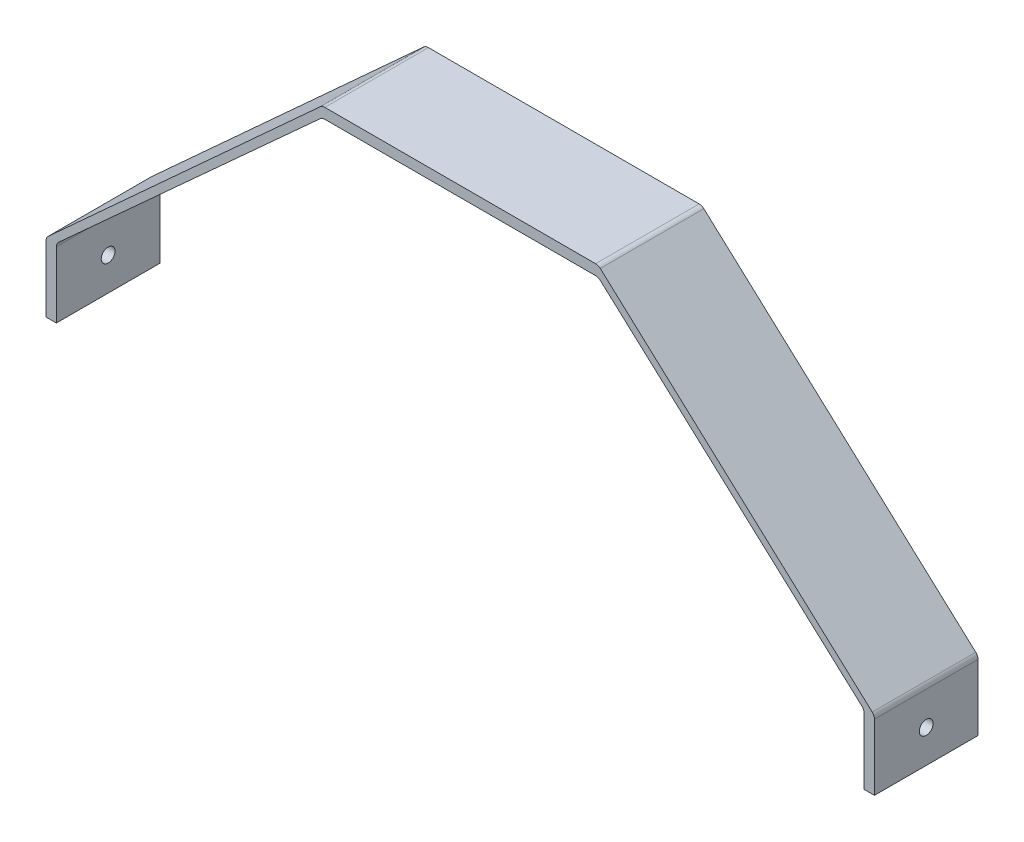
ISO-10303-21;
HEADER;
FILE_DESCRIPTION(('STEP AP214'),'2;1');
FILE_NAME('part.step','',(''),(''),'','','');
FILE_SCHEMA(('AUTOMOTIVE_DESIGN { 1 0 10303 214 1 1 1 1 }'));
ENDSEC;
DATA;
#1=APPLICATION_CONTEXT('core data for automotive mechanical design processes');
#2=APPLICATION_PROTOCOL_DEFINITION('international standard','automotive_design',2000,#1);
#3=PRODUCT_CONTEXT('',#1,'mechanical');
#4=PRODUCT('Part','Part','',(#3));
#5=PRODUCT_RELATED_PRODUCT_CATEGORY('part','',(#4));
#6=PRODUCT_DEFINITION_FORMATION('','',#4);
#7=PRODUCT_DEFINITION_CONTEXT('part definition',#1,'design');
#8=PRODUCT_DEFINITION('design','',#6,#7);
#9=PRODUCT_DEFINITION_SHAPE('','',#8);
#10=(LENGTH_UNIT() NAMED_UNIT(*) SI_UNIT(.MILLI.,.METRE.));
#11=(NAMED_UNIT(*) PLANE_ANGLE_UNIT() SI_UNIT($,.RADIAN.));
#12=(NAMED_UNIT(*) SI_UNIT($,.STERADIAN.) SOLID_ANGLE_UNIT());
#13=UNCERTAINTY_MEASURE_WITH_UNIT(LENGTH_MEASURE(1.E-05),#10,'distance_accuracy_value','');
#14=(GEOMETRIC_REPRESENTATION_CONTEXT(3) GLOBAL_UNCERTAINTY_ASSIGNED_CONTEXT((#13)) GLOBAL_UNIT_ASSIGNED_CONTEXT((#10,
#11,#12)) REPRESENTATION_CONTEXT('',''));
#15=CARTESIAN_POINT('',(0.,0.,0.));
#16=DIRECTION('',(0.,0.,1.));
#17=DIRECTION('',(1.,0.,0.));
#18=AXIS2_PLACEMENT_3D('',#15,#16,#17);
#19=CARTESIAN_POINT('',(50.8,1.90500000000001,-38.1));
#20=DIRECTION('',(0.674050394139193,0.738685363440212,0.));
#21=DIRECTION('',(-0.738685363440212,0.674050394139193,0.));
#22=AXIS2_PLACEMENT_3D('',#19,#20,#21);
#23=PLANE('',#22);
#24=DIRECTION('',(-0.738685363440212,0.674050394139193,0.));
#25=VECTOR('',#24,1.);
#26=CARTESIAN_POINT('',(50.8,1.90500000000001,-38.1));
#27=LINE('',#26,#25);
#28=CARTESIAN_POINT('',(151.572088001114,-90.049530301016,-38.1));
#29=VERTEX_POINT('',#28);
#30=CARTESIAN_POINT('',(51.5273853993007,1.24126082313814,-38.1));
#31=VERTEX_POINT('',#30);
#32=EDGE_CURVE('E277',#29,#31,#27,.T.);
#33=ORIENTED_EDGE('',*,*,#32,.T.);
#34=DIRECTION('',(0.,0.,1.));
#35=VECTOR('',#34,1.);
#36=CARTESIAN_POINT('',(51.5273853993007,1.24126082313814,-38.1));
#37=LINE('',#36,#35);
#38=CARTESIAN_POINT('',(51.5273853993007,1.24126082313814,0.));
#39=VERTEX_POINT('',#38);
#40=EDGE_CURVE('E304',#31,#39,#37,.T.);
#41=ORIENTED_EDGE('',*,*,#40,.T.);
#42=DIRECTION('',(-0.738685363440212,0.674050394139193,0.));
#43=VECTOR('',#42,1.);
#44=CARTESIAN_POINT('',(50.8,1.90500000000001,0.));
#45=LINE('',#44,#43);
#46=CARTESIAN_POINT('',(151.572088001114,-90.049530301016,0.));
#47=VERTEX_POINT('',#46);
#48=EDGE_CURVE('E232',#47,#39,#45,.T.);
#49=ORIENTED_EDGE('',*,*,#48,.F.);
#50=DIRECTION('',(0.,0.,1.));
#51=VECTOR('',#50,1.);
#52=CARTESIAN_POINT('',(151.572088001114,-90.049530301016,-38.1));
#53=LINE('',#52,#51);
#54=EDGE_CURVE('E301',#47,#29,#53,.F.);
#55=ORIENTED_EDGE('',*,*,#54,.T.);
#56=EDGE_LOOP('',(#33,#41,#49,#55));
#57=FACE_BOUND('',#56,.T.);
#58=ADVANCED_FACE('F39',(#57),#23,.T.);
#59=CARTESIAN_POINT('',(152.4,-116.205,-38.1));
#60=DIRECTION('',(1.,0.,0.));
#61=DIRECTION('',(0.,1.,0.));
#62=AXIS2_PLACEMENT_3D('',#59,#60,#61);
#63=PLANE('',#62);
#64=CARTESIAN_POINT('',(152.4,-104.065395562077,-19.05));
#65=DIRECTION('',(1.,0.,0.));
#66=DIRECTION('',(0.,0.,-1.));
#67=AXIS2_PLACEMENT_3D('',#64,#65,#66);
#68=CIRCLE('',#67,2.53999999999999);
#69=CARTESIAN_POINT('',(152.4,-104.065395562077,-21.59));
#70=VERTEX_POINT('',#69);
#71=EDGE_CURVE('E435',#70,#70,#68,.T.);
#72=ORIENTED_EDGE('',*,*,#71,.F.);
#73=EDGE_LOOP('',(#72));
#74=FACE_BOUND('',#73,.T.);
#75=DIRECTION('',(0.,1.,0.));
#76=VECTOR('',#75,1.);
#77=CARTESIAN_POINT('',(152.4,-116.205,-38.1));
#78=LINE('',#77,#76);
#79=CARTESIAN_POINT('',(152.4,-116.205,-38.1));
#80=VERTEX_POINT('',#79);
#81=CARTESIAN_POINT('',(152.4,-91.9257911241542,-38.1));
#82=VERTEX_POINT('',#81);
#83=EDGE_CURVE('E197',#80,#82,#78,.T.);
#84=ORIENTED_EDGE('',*,*,#83,.T.);
#85=DIRECTION('',(0.,0.,1.));
#86=VECTOR('',#85,1.);
#87=CARTESIAN_POINT('',(152.4,-91.9257911241542,-38.1));
#88=LINE('',#87,#86);
#89=CARTESIAN_POINT('',(152.4,-91.9257911241542,0.));
#90=VERTEX_POINT('',#89);
#91=EDGE_CURVE('E338',#82,#90,#88,.T.);
#92=ORIENTED_EDGE('',*,*,#91,.T.);
#93=DIRECTION('',(0.,1.,0.));
#94=VECTOR('',#93,1.);
#95=CARTESIAN_POINT('',(152.4,-116.205,0.));
#96=LINE('',#95,#94);
#97=CARTESIAN_POINT('',(152.4,-116.205,0.));
#98=VERTEX_POINT('',#97);
#99=EDGE_CURVE('E273',#98,#90,#96,.T.);
#100=ORIENTED_EDGE('',*,*,#99,.F.);
#101=DIRECTION('',(0.,0.,1.));
#102=VECTOR('',#101,1.);
#103=CARTESIAN_POINT('',(152.4,-116.205,-38.1));
#104=LINE('',#103,#102);
#105=EDGE_CURVE('E278',#80,#98,#104,.T.);
#106=ORIENTED_EDGE('',*,*,#105,.F.);
#107=EDGE_LOOP('',(#84,#92,#100,#106));
#108=FACE_BOUND('',#107,.T.);
#109=ADVANCED_FACE('F456',(#74,#108),#63,.T.);
#110=CARTESIAN_POINT('',(152.4,-116.205,-38.1));
#111=DIRECTION('',(0.,-1.,0.));
#112=DIRECTION('',(1.,0.,0.));
#113=AXIS2_PLACEMENT_3D('',#110,#111,#112);
#114=PLANE('',#113);
#115=DIRECTION('',(1.,0.,0.));
#116=VECTOR('',#115,1.);
#117=CARTESIAN_POINT('',(152.4,-116.205,0.));
#118=LINE('',#117,#116);
#119=CARTESIAN_POINT('',(148.59,-116.205,0.));
#120=VERTEX_POINT('',#119);
#121=EDGE_CURVE('E269',#120,#98,#118,.T.);
#122=ORIENTED_EDGE('',*,*,#121,.F.);
#123=DIRECTION('',(0.,0.,1.));
#124=VECTOR('',#123,1.);
#125=CARTESIAN_POINT('',(148.59,-116.205,-38.1));
#126=LINE('',#125,#124);
#127=CARTESIAN_POINT('',(148.59,-116.205,-38.1));
#128=VERTEX_POINT('',#127);
#129=EDGE_CURVE('E282',#128,#120,#126,.T.);
#130=ORIENTED_EDGE('',*,*,#129,.F.);
#131=DIRECTION('',(1.,0.,0.));
#132=VECTOR('',#131,1.);
#133=CARTESIAN_POINT('',(152.4,-116.205,-38.1));
#134=LINE('',#133,#132);
#135=EDGE_CURVE('E225',#128,#80,#134,.T.);
#136=ORIENTED_EDGE('',*,*,#135,.T.);
#137=ORIENTED_EDGE('',*,*,#105,.T.);
#138=EDGE_LOOP('',(#122,#130,#136,#137));
#139=FACE_BOUND('',#138,.T.);
#140=ADVANCED_FACE('F462',(#139),#114,.T.);
#141=CARTESIAN_POINT('',(148.59,-116.205,-38.1));
#142=DIRECTION('',(-1.,0.,0.));
#143=DIRECTION('',(0.,-1.,0.));
#144=AXIS2_PLACEMENT_3D('',#141,#142,#143);
#145=PLANE('',#144);
#146=CARTESIAN_POINT('',(148.59,-104.065395562077,-19.05));
#147=DIRECTION('',(-1.,0.,0.));
#148=DIRECTION('',(0.,-1.,0.));
#149=AXIS2_PLACEMENT_3D('',#146,#147,#148);
#150=CIRCLE('',#149,2.53999999999999);
#151=CARTESIAN_POINT('',(148.59,-106.605395562077,-19.05));
#152=VERTEX_POINT('',#151);
#153=EDGE_CURVE('E237',#152,#152,#150,.T.);
#154=ORIENTED_EDGE('',*,*,#153,.F.);
#155=EDGE_LOOP('',(#154));
#156=FACE_BOUND('',#155,.T.);
#157=DIRECTION('',(0.,-1.,0.));
#158=VECTOR('',#157,1.);
#159=CARTESIAN_POINT('',(148.59,-116.205,0.));
#160=LINE('',#159,#158);
#161=CARTESIAN_POINT('',(148.59,-91.9286195107444,0.));
#162=VERTEX_POINT('',#161);
#163=EDGE_CURVE('E266',#162,#120,#160,.T.);
#164=ORIENTED_EDGE('',*,*,#163,.F.);
#165=DIRECTION('',(0.,0.,1.));
#166=VECTOR('',#165,1.);
#167=CARTESIAN_POINT('',(148.59,-91.9286195107444,-38.1));
#168=LINE('',#167,#166);
#169=CARTESIAN_POINT('',(148.59,-91.9286195107444,-38.1));
#170=VERTEX_POINT('',#169);
#171=EDGE_CURVE('E342',#162,#170,#168,.F.);
#172=ORIENTED_EDGE('',*,*,#171,.T.);
#173=DIRECTION('',(0.,-1.,0.));
#174=VECTOR('',#173,1.);
#175=CARTESIAN_POINT('',(148.59,-116.205,-38.1));
#176=LINE('',#175,#174);
#177=EDGE_CURVE('E222',#170,#128,#176,.T.);
#178=ORIENTED_EDGE('',*,*,#177,.T.);
#179=ORIENTED_EDGE('',*,*,#129,.T.);
#180=EDGE_LOOP('',(#164,#172,#178,#179));
#181=FACE_BOUND('',#180,.T.);
#182=ADVANCED_FACE('F511',(#156,#181),#145,.T.);
#183=CARTESIAN_POINT('',(50.8,-1.90499999999999,-38.1));
#184=DIRECTION('',(-0.672672793996312,-0.739940073395944,0.));
#185=DIRECTION('',(0.739940073395944,-0.672672793996312,0.));
#186=AXIS2_PLACEMENT_3D('',#183,#184,#185);
#187=PLANE('',#186);
#188=DIRECTION('',(0.739940073395944,-0.672672793996312,0.));
#189=VECTOR('',#188,1.);
#190=CARTESIAN_POINT('',(50.8,-1.90499999999999,0.));
#191=LINE('',#190,#189);
#192=CARTESIAN_POINT('',(51.5266074349317,-2.56555221357428,0.));
#193=VERTEX_POINT('',#192);
#194=CARTESIAN_POINT('',(147.758588896751,-90.0491717243186,0.));
#195=VERTEX_POINT('',#194);
#196=EDGE_CURVE('E262',#193,#195,#191,.T.);
#197=ORIENTED_EDGE('',*,*,#196,.F.);
#198=DIRECTION('',(0.,0.,1.));
#199=VECTOR('',#198,1.);
#200=CARTESIAN_POINT('',(51.5266074349317,-2.56555221357428,-38.1));
#201=LINE('',#200,#199);
#202=CARTESIAN_POINT('',(51.5266074349317,-2.56555221357428,-38.1));
#203=VERTEX_POINT('',#202);
#204=EDGE_CURVE('E298',#193,#203,#201,.F.);
#205=ORIENTED_EDGE('',*,*,#204,.T.);
#206=DIRECTION('',(0.739940073395944,-0.672672793996312,0.));
#207=VECTOR('',#206,1.);
#208=CARTESIAN_POINT('',(50.8,-1.90499999999999,-38.1));
#209=LINE('',#208,#207);
#210=CARTESIAN_POINT('',(147.758588896751,-90.0491717243186,-38.1));
#211=VERTEX_POINT('',#210);
#212=EDGE_CURVE('E218',#203,#211,#209,.T.);
#213=ORIENTED_EDGE('',*,*,#212,.T.);
#214=DIRECTION('',(0.,0.,1.));
#215=VECTOR('',#214,1.);
#216=CARTESIAN_POINT('',(147.758588896751,-90.0491717243187,0.));
#217=LINE('',#216,#215);
#218=EDGE_CURVE('E294',#211,#195,#217,.T.);
#219=ORIENTED_EDGE('',*,*,#218,.T.);
#220=EDGE_LOOP('',(#197,#205,#213,#219));
#221=FACE_BOUND('',#220,.T.);
#222=ADVANCED_FACE('F516',(#221),#187,.T.);
#223=CARTESIAN_POINT('',(-50.8,-1.90500000000001,-38.1));
#224=DIRECTION('',(0.,-1.,0.));
#225=DIRECTION('',(1.,0.,0.));
#226=AXIS2_PLACEMENT_3D('',#223,#224,#225);
#227=PLANE('',#226);
#228=DIRECTION('',(1.,0.,0.));
#229=VECTOR('',#228,1.);
#230=CARTESIAN_POINT('',(-50.8,-1.90500000000001,-38.1));
#231=LINE('',#230,#229);
#232=CARTESIAN_POINT('',(-49.8180185381811,-1.90500000000001,-38.1));
#233=VERTEX_POINT('',#232);
#234=CARTESIAN_POINT('',(49.8180185381811,-1.90499999999999,-38.1));
#235=VERTEX_POINT('',#234);
#236=EDGE_CURVE('E214',#233,#235,#231,.T.);
#237=ORIENTED_EDGE('',*,*,#236,.T.);
#238=DIRECTION('',(0.,0.,1.));
#239=VECTOR('',#238,1.);
#240=CARTESIAN_POINT('',(49.8180185381811,-1.90499999999999,0.));
#241=LINE('',#240,#239);
#242=CARTESIAN_POINT('',(49.8180185381811,-1.90499999999999,0.));
#243=VERTEX_POINT('',#242);
#244=EDGE_CURVE('E290',#235,#243,#241,.T.);
#245=ORIENTED_EDGE('',*,*,#244,.T.);
#246=DIRECTION('',(1.,0.,0.));
#247=VECTOR('',#246,1.);
#248=CARTESIAN_POINT('',(-50.8,-1.90500000000001,0.));
#249=LINE('',#248,#247);
#250=CARTESIAN_POINT('',(-49.8180185381811,-1.90500000000001,0.));
#251=VERTEX_POINT('',#250);
#252=EDGE_CURVE('E258',#251,#243,#249,.T.);
#253=ORIENTED_EDGE('',*,*,#252,.F.);
#254=DIRECTION('',(0.,0.,1.));
#255=VECTOR('',#254,1.);
#256=CARTESIAN_POINT('',(-49.8180185381811,-1.90500000000001,-38.1));
#257=LINE('',#256,#255);
#258=EDGE_CURVE('E281',#251,#233,#257,.F.);
#259=ORIENTED_EDGE('',*,*,#258,.T.);
#260=EDGE_LOOP('',(#237,#245,#253,#259));
#261=FACE_BOUND('',#260,.T.);
#262=ADVANCED_FACE('F390',(#261),#227,.T.);
#263=CARTESIAN_POINT('',(-148.59,-90.8049999999999,-38.1));
#264=DIRECTION('',(0.672672793996312,-0.739940073395944,0.));
#265=DIRECTION('',(0.739940073395944,0.672672793996313,0.));
#266=AXIS2_PLACEMENT_3D('',#263,#264,#265);
#267=PLANE('',#266);
#268=DIRECTION('',(0.739940073395944,0.672672793996312,0.));
#269=VECTOR('',#268,1.);
#270=CARTESIAN_POINT('',(-148.59,-90.8049999999999,0.));
#271=LINE('',#270,#269);
#272=CARTESIAN_POINT('',(-147.758588896751,-90.0491717243187,0.));
#273=VERTEX_POINT('',#272);
#274=CARTESIAN_POINT('',(-51.5266074349317,-2.56555221357432,0.));
#275=VERTEX_POINT('',#274);
#276=EDGE_CURVE('E254',#273,#275,#271,.T.);
#277=ORIENTED_EDGE('',*,*,#276,.F.);
#278=DIRECTION('',(0.,0.,1.));
#279=VECTOR('',#278,1.);
#280=CARTESIAN_POINT('',(-147.758588896751,-90.0491717243187,-38.1));
#281=LINE('',#280,#279);
#282=CARTESIAN_POINT('',(-147.758588896751,-90.0491717243187,-38.1));
#283=VERTEX_POINT('',#282);
#284=EDGE_CURVE('E353',#273,#283,#281,.F.);
#285=ORIENTED_EDGE('',*,*,#284,.T.);
#286=DIRECTION('',(0.739940073395944,0.672672793996312,0.));
#287=VECTOR('',#286,1.);
#288=CARTESIAN_POINT('',(-148.59,-90.8049999999999,-38.1));
#289=LINE('',#288,#287);
#290=CARTESIAN_POINT('',(-51.5266074349317,-2.56555221357432,-38.1));
#291=VERTEX_POINT('',#290);
#292=EDGE_CURVE('E207',#283,#291,#289,.T.);
#293=ORIENTED_EDGE('',*,*,#292,.T.);
#294=DIRECTION('',(0.,0.,1.));
#295=VECTOR('',#294,1.);
#296=CARTESIAN_POINT('',(-51.5266074349318,-2.56555221357431,0.));
#297=LINE('',#296,#295);
#298=EDGE_CURVE('E349',#291,#275,#297,.T.);
#299=ORIENTED_EDGE('',*,*,#298,.T.);
#300=EDGE_LOOP('',(#277,#285,#293,#299));
#301=FACE_BOUND('',#300,.T.);
#302=ADVANCED_FACE('F398',(#301),#267,.T.);
#303=CARTESIAN_POINT('',(-148.59,-116.205,-38.1));
#304=DIRECTION('',(1.,0.,0.));
#305=DIRECTION('',(0.,0.,-1.));
#306=AXIS2_PLACEMENT_3D('',#303,#304,#305);
#307=PLANE('',#306);
#308=CARTESIAN_POINT('',(-148.59,-104.065395562077,-19.05));
#309=DIRECTION('',(1.,0.,0.));
#310=DIRECTION('',(0.,0.,-1.));
#311=AXIS2_PLACEMENT_3D('',#308,#309,#310);
#312=CIRCLE('',#311,2.53999999999999);
#313=CARTESIAN_POINT('',(-148.59,-104.065395562077,-21.59));
#314=VERTEX_POINT('',#313);
#315=EDGE_CURVE('E430',#314,#314,#312,.T.);
#316=ORIENTED_EDGE('',*,*,#315,.F.);
#317=EDGE_LOOP('',(#316));
#318=FACE_BOUND('',#317,.T.);
#319=DIRECTION('',(0.,1.,0.));
#320=VECTOR('',#319,1.);
#321=CARTESIAN_POINT('',(-148.59,-116.205,-38.1));
#322=LINE('',#321,#320);
#323=CARTESIAN_POINT('',(-148.59,-116.205,-38.1));
#324=VERTEX_POINT('',#323);
#325=CARTESIAN_POINT('',(-148.59,-91.9286195107444,-38.1));
#326=VERTEX_POINT('',#325);
#327=EDGE_CURVE('E203',#324,#326,#322,.T.);
#328=ORIENTED_EDGE('',*,*,#327,.T.);
#329=DIRECTION('',(0.,0.,1.));
#330=VECTOR('',#329,1.);
#331=CARTESIAN_POINT('',(-148.59,-91.9286195107444,0.));
#332=LINE('',#331,#330);
#333=CARTESIAN_POINT('',(-148.59,-91.9286195107444,0.));
#334=VERTEX_POINT('',#333);
#335=EDGE_CURVE('E345',#326,#334,#332,.T.);
#336=ORIENTED_EDGE('',*,*,#335,.T.);
#337=DIRECTION('',(0.,1.,0.));
#338=VECTOR('',#337,1.);
#339=CARTESIAN_POINT('',(-148.59,-116.205,0.));
#340=LINE('',#339,#338);
#341=CARTESIAN_POINT('',(-148.59,-116.205,0.));
#342=VERTEX_POINT('',#341);
#343=EDGE_CURVE('E250',#342,#334,#340,.T.);
#344=ORIENTED_EDGE('',*,*,#343,.F.);
#345=DIRECTION('',(0.,0.,1.));
#346=VECTOR('',#345,1.);
#347=CARTESIAN_POINT('',(-148.59,-116.205,-38.1));
#348=LINE('',#347,#346);
#349=EDGE_CURVE('E196',#324,#342,#348,.T.);
#350=ORIENTED_EDGE('',*,*,#349,.F.);
#351=EDGE_LOOP('',(#328,#336,#344,#350));
#352=FACE_BOUND('',#351,.T.);
#353=ADVANCED_FACE('F404',(#318,#352),#307,.T.);
#354=CARTESIAN_POINT('',(-152.4,-116.205,-38.1));
#355=DIRECTION('',(0.,-1.,0.));
#356=DIRECTION('',(1.,0.,0.));
#357=AXIS2_PLACEMENT_3D('',#354,#355,#356);
#358=PLANE('',#357);
#359=DIRECTION('',(1.,0.,0.));
#360=VECTOR('',#359,1.);
#361=CARTESIAN_POINT('',(-152.4,-116.205,0.));
#362=LINE('',#361,#360);
#363=CARTESIAN_POINT('',(-152.4,-116.205,0.));
#364=VERTEX_POINT('',#363);
#365=EDGE_CURVE('E194',#364,#342,#362,.T.);
#366=ORIENTED_EDGE('',*,*,#365,.F.);
#367=DIRECTION('',(0.,0.,1.));
#368=VECTOR('',#367,1.);
#369=CARTESIAN_POINT('',(-152.4,-116.205,-38.1));
#370=LINE('',#369,#368);
#371=CARTESIAN_POINT('',(-152.4,-116.205,-38.1));
#372=VERTEX_POINT('',#371);
#373=EDGE_CURVE('E181',#372,#364,#370,.T.);
#374=ORIENTED_EDGE('',*,*,#373,.F.);
#375=DIRECTION('',(1.,0.,0.));
#376=VECTOR('',#375,1.);
#377=CARTESIAN_POINT('',(-152.4,-116.205,-38.1));
#378=LINE('',#377,#376);
#379=EDGE_CURVE('E187',#372,#324,#378,.T.);
#380=ORIENTED_EDGE('',*,*,#379,.T.);
#381=ORIENTED_EDGE('',*,*,#349,.T.);
#382=EDGE_LOOP('',(#366,#374,#380,#381));
#383=FACE_BOUND('',#382,.T.);
#384=ADVANCED_FACE('F192',(#383),#358,.T.);
#385=CARTESIAN_POINT('',(-152.4,-116.205,-38.1));
#386=DIRECTION('',(-1.,0.,0.));
#387=DIRECTION('',(0.,-1.,0.));
#388=AXIS2_PLACEMENT_3D('',#385,#386,#387);
#389=PLANE('',#388);
#390=CARTESIAN_POINT('',(-152.4,-104.065395562077,-19.05));
#391=DIRECTION('',(1.,0.,0.));
#392=DIRECTION('',(0.,0.,-1.));
#393=AXIS2_PLACEMENT_3D('',#390,#391,#392);
#394=CIRCLE('',#393,2.53999999999999);
#395=CARTESIAN_POINT('',(-152.4,-104.065395562077,-21.59));
#396=VERTEX_POINT('',#395);
#397=EDGE_CURVE('E434',#396,#396,#394,.T.);
#398=ORIENTED_EDGE('',*,*,#397,.T.);
#399=EDGE_LOOP('',(#398));
#400=FACE_BOUND('',#399,.T.);
#401=DIRECTION('',(0.,-1.,0.));
#402=VECTOR('',#401,1.);
#403=CARTESIAN_POINT('',(-152.4,-116.205,0.));
#404=LINE('',#403,#402);
#405=CARTESIAN_POINT('',(-152.4,-91.9257911241543,0.));
#406=VERTEX_POINT('',#405);
#407=EDGE_CURVE('E245',#406,#364,#404,.T.);
#408=ORIENTED_EDGE('',*,*,#407,.F.);
#409=DIRECTION('',(0.,0.,1.));
#410=VECTOR('',#409,1.);
#411=CARTESIAN_POINT('',(-152.4,-91.9257911241543,-38.1));
#412=LINE('',#411,#410);
#413=CARTESIAN_POINT('',(-152.4,-91.9257911241543,-38.1));
#414=VERTEX_POINT('',#413);
#415=EDGE_CURVE('E184',#406,#414,#412,.F.);
#416=ORIENTED_EDGE('',*,*,#415,.T.);
#417=DIRECTION('',(0.,-1.,0.));
#418=VECTOR('',#417,1.);
#419=CARTESIAN_POINT('',(-152.4,-116.205,-38.1));
#420=LINE('',#419,#418);
#421=EDGE_CURVE('E177',#414,#372,#420,.T.);
#422=ORIENTED_EDGE('',*,*,#421,.T.);
#423=ORIENTED_EDGE('',*,*,#373,.T.);
#424=EDGE_LOOP('',(#408,#416,#422,#423));
#425=FACE_BOUND('',#424,.T.);
#426=ADVANCED_FACE('F180',(#400,#425),#389,.T.);
#427=CARTESIAN_POINT('',(-152.4,-90.805,-38.1));
#428=DIRECTION('',(-0.674050394139193,0.738685363440212,0.));
#429=DIRECTION('',(-0.738685363440212,-0.674050394139193,0.));
#430=AXIS2_PLACEMENT_3D('',#427,#428,#429);
#431=PLANE('',#430);
#432=DIRECTION('',(-0.738685363440212,-0.674050394139193,0.));
#433=VECTOR('',#432,1.);
#434=CARTESIAN_POINT('',(-152.4,-90.805,-38.1));
#435=LINE('',#434,#433);
#436=CARTESIAN_POINT('',(-51.5273853993007,1.24126082313815,-38.1));
#437=VERTEX_POINT('',#436);
#438=CARTESIAN_POINT('',(-151.572088001114,-90.0495303010161,-38.1));
#439=VERTEX_POINT('',#438);
#440=EDGE_CURVE('E188',#437,#439,#435,.T.);
#441=ORIENTED_EDGE('',*,*,#440,.T.);
#442=DIRECTION('',(0.,0.,1.));
#443=VECTOR('',#442,1.);
#444=CARTESIAN_POINT('',(-151.572088001114,-90.0495303010161,-38.1));
#445=LINE('',#444,#443);
#446=CARTESIAN_POINT('',(-151.572088001114,-90.0495303010161,0.));
#447=VERTEX_POINT('',#446);
#448=EDGE_CURVE('E358',#439,#447,#445,.T.);
#449=ORIENTED_EDGE('',*,*,#448,.T.);
#450=DIRECTION('',(-0.738685363440212,-0.674050394139193,0.));
#451=VECTOR('',#450,1.);
#452=CARTESIAN_POINT('',(-152.4,-90.805,0.));
#453=LINE('',#452,#451);
#454=CARTESIAN_POINT('',(-51.5273853993007,1.24126082313815,0.));
#455=VERTEX_POINT('',#454);
#456=EDGE_CURVE('E241',#455,#447,#453,.T.);
#457=ORIENTED_EDGE('',*,*,#456,.F.);
#458=DIRECTION('',(0.,0.,1.));
#459=VECTOR('',#458,1.);
#460=CARTESIAN_POINT('',(-51.5273853993007,1.24126082313815,-38.1));
#461=LINE('',#460,#459);
#462=EDGE_CURVE('E62',#455,#437,#461,.F.);
#463=ORIENTED_EDGE('',*,*,#462,.T.);
#464=EDGE_LOOP('',(#441,#449,#457,#463));
#465=FACE_BOUND('',#464,.T.);
#466=ADVANCED_FACE('F409',(#465),#431,.T.);
#467=CARTESIAN_POINT('',(-50.8,1.90499999999999,-38.1));
#468=DIRECTION('',(0.,1.,0.));
#469=DIRECTION('',(-1.,0.,0.));
#470=AXIS2_PLACEMENT_3D('',#467,#468,#469);
#471=PLANE('',#470);
#472=DIRECTION('',(-1.,0.,0.));
#473=VECTOR('',#472,1.);
#474=CARTESIAN_POINT('',(-50.8,1.90499999999999,0.));
#475=LINE('',#474,#473);
#476=CARTESIAN_POINT('',(49.8152973981871,1.90500000000001,0.));
#477=VERTEX_POINT('',#476);
#478=CARTESIAN_POINT('',(-49.8152973981871,1.90499999999999,0.));
#479=VERTEX_POINT('',#478);
#480=EDGE_CURVE('E236',#477,#479,#475,.T.);
#481=ORIENTED_EDGE('',*,*,#480,.F.);
#482=DIRECTION('',(0.,0.,1.));
#483=VECTOR('',#482,1.);
#484=CARTESIAN_POINT('',(49.8152973981871,1.90500000000001,-38.1));
#485=LINE('',#484,#483);
#486=CARTESIAN_POINT('',(49.8152973981871,1.90500000000001,-38.1));
#487=VERTEX_POINT('',#486);
#488=EDGE_CURVE('E324',#477,#487,#485,.F.);
#489=ORIENTED_EDGE('',*,*,#488,.T.);
#490=DIRECTION('',(-1.,0.,0.));
#491=VECTOR('',#490,1.);
#492=CARTESIAN_POINT('',(-50.8,1.90499999999999,-38.1));
#493=LINE('',#492,#491);
#494=CARTESIAN_POINT('',(-49.8152973981871,1.90499999999999,-38.1));
#495=VERTEX_POINT('',#494);
#496=EDGE_CURVE('E418',#487,#495,#493,.T.);
#497=ORIENTED_EDGE('',*,*,#496,.T.);
#498=DIRECTION('',(0.,0.,1.));
#499=VECTOR('',#498,1.);
#500=CARTESIAN_POINT('',(-49.8152973981871,1.90499999999999,-38.1));
#501=LINE('',#500,#499);
#502=EDGE_CURVE('E320',#495,#479,#501,.T.);
#503=ORIENTED_EDGE('',*,*,#502,.T.);
#504=EDGE_LOOP('',(#481,#489,#497,#503));
#505=FACE_BOUND('',#504,.T.);
#506=ADVANCED_FACE('F416',(#505),#471,.T.);
#507=CARTESIAN_POINT('',(0.,0.,-38.1));
#508=DIRECTION('',(0.,0.,1.));
#509=DIRECTION('',(1.,0.,0.));
#510=AXIS2_PLACEMENT_3D('',#507,#508,#509);
#511=PLANE('',#510);
#512=ORIENTED_EDGE('',*,*,#496,.F.);
#513=CARTESIAN_POINT('',(49.8152973981871,-0.634999999999994,-38.1));
#514=DIRECTION('',(0.,0.,1.));
#515=DIRECTION('',(1.,0.,0.));
#516=AXIS2_PLACEMENT_3D('',#513,#514,#515);
#517=CIRCLE('',#516,2.54);
#518=EDGE_CURVE('E335',#487,#31,#517,.F.);
#519=ORIENTED_EDGE('',*,*,#518,.T.);
#520=ORIENTED_EDGE('',*,*,#32,.F.);
#521=CARTESIAN_POINT('',(149.86,-91.9257911241542,-38.1));
#522=DIRECTION('',(0.,0.,1.));
#523=DIRECTION('',(1.,0.,0.));
#524=AXIS2_PLACEMENT_3D('',#521,#522,#523);
#525=CIRCLE('',#524,2.54);
#526=EDGE_CURVE('E332',#29,#82,#525,.F.);
#527=ORIENTED_EDGE('',*,*,#526,.T.);
#528=ORIENTED_EDGE('',*,*,#83,.F.);
#529=ORIENTED_EDGE('',*,*,#135,.F.);
#530=ORIENTED_EDGE('',*,*,#177,.F.);
#531=CARTESIAN_POINT('',(146.05,-91.9286195107444,-38.1));
#532=DIRECTION('',(0.,0.,1.));
#533=DIRECTION('',(1.,0.,0.));
#534=AXIS2_PLACEMENT_3D('',#531,#532,#533);
#535=CIRCLE('',#534,2.54);
#536=EDGE_CURVE('E373',#170,#211,#535,.T.);
#537=ORIENTED_EDGE('',*,*,#536,.T.);
#538=ORIENTED_EDGE('',*,*,#212,.F.);
#539=CARTESIAN_POINT('',(49.8180185381811,-4.44499999999999,-38.1));
#540=DIRECTION('',(0.,0.,1.));
#541=DIRECTION('',(1.,0.,0.));
#542=AXIS2_PLACEMENT_3D('',#539,#540,#541);
#543=CIRCLE('',#542,2.54);
#544=EDGE_CURVE('E367',#203,#235,#543,.T.);
#545=ORIENTED_EDGE('',*,*,#544,.T.);
#546=ORIENTED_EDGE('',*,*,#236,.F.);
#547=CARTESIAN_POINT('',(-49.8180185381811,-4.44500000000002,-38.1));
#548=DIRECTION('',(0.,0.,1.));
#549=DIRECTION('',(1.,0.,0.));
#550=AXIS2_PLACEMENT_3D('',#547,#548,#549);
#551=CIRCLE('',#550,2.54);
#552=EDGE_CURVE('E11',#233,#291,#551,.T.);
#553=ORIENTED_EDGE('',*,*,#552,.T.);
#554=ORIENTED_EDGE('',*,*,#292,.F.);
#555=CARTESIAN_POINT('',(-146.05,-91.9286195107444,-38.1));
#556=DIRECTION('',(0.,0.,1.));
#557=DIRECTION('',(1.,0.,0.));
#558=AXIS2_PLACEMENT_3D('',#555,#556,#557);
#559=CIRCLE('',#558,2.54);
#560=EDGE_CURVE('E379',#283,#326,#559,.T.);
#561=ORIENTED_EDGE('',*,*,#560,.T.);
#562=ORIENTED_EDGE('',*,*,#327,.F.);
#563=ORIENTED_EDGE('',*,*,#379,.F.);
#564=ORIENTED_EDGE('',*,*,#421,.F.);
#565=CARTESIAN_POINT('',(-149.86,-91.9257911241543,-38.1));
#566=DIRECTION('',(0.,0.,1.));
#567=DIRECTION('',(1.,0.,0.));
#568=AXIS2_PLACEMENT_3D('',#565,#566,#567);
#569=CIRCLE('',#568,2.54);
#570=EDGE_CURVE('E55',#414,#439,#569,.F.);
#571=ORIENTED_EDGE('',*,*,#570,.T.);
#572=ORIENTED_EDGE('',*,*,#440,.F.);
#573=CARTESIAN_POINT('',(-49.8152973981871,-0.635000000000006,-38.1));
#574=DIRECTION('',(0.,0.,1.));
#575=DIRECTION('',(1.,0.,0.));
#576=AXIS2_PLACEMENT_3D('',#573,#574,#575);
#577=CIRCLE('',#576,2.54);
#578=EDGE_CURVE('E327',#437,#495,#577,.F.);
#579=ORIENTED_EDGE('',*,*,#578,.T.);
#580=EDGE_LOOP('',(#512,#519,#520,#527,#528,#529,#530,#537,#538,#545,#546,#553,#554,#561,#562,
#563,#564,#571,#572,#579));
#581=FACE_BOUND('',#580,.T.);
#582=ADVANCED_FACE('F201',(#581),#511,.F.);
#583=CARTESIAN_POINT('',(0.,0.,0.));
#584=DIRECTION('',(0.,0.,1.));
#585=DIRECTION('',(1.,0.,0.));
#586=AXIS2_PLACEMENT_3D('',#583,#584,#585);
#587=PLANE('',#586);
#588=ORIENTED_EDGE('',*,*,#48,.T.);
#589=CARTESIAN_POINT('',(49.8152973981871,-0.634999999999994,0.));
#590=DIRECTION('',(0.,0.,1.));
#591=DIRECTION('',(1.,0.,0.));
#592=AXIS2_PLACEMENT_3D('',#589,#590,#591);
#593=CIRCLE('',#592,2.54);
#594=EDGE_CURVE('E317',#39,#477,#593,.T.);
#595=ORIENTED_EDGE('',*,*,#594,.T.);
#596=ORIENTED_EDGE('',*,*,#480,.T.);
#597=CARTESIAN_POINT('',(-49.8152973981871,-0.635000000000006,0.));
#598=DIRECTION('',(0.,0.,1.));
#599=DIRECTION('',(1.,0.,0.));
#600=AXIS2_PLACEMENT_3D('',#597,#598,#599);
#601=CIRCLE('',#600,2.54);
#602=EDGE_CURVE('E308',#479,#455,#601,.T.);
#603=ORIENTED_EDGE('',*,*,#602,.T.);
#604=ORIENTED_EDGE('',*,*,#456,.T.);
#605=CARTESIAN_POINT('',(-149.86,-91.9257911241543,0.));
#606=DIRECTION('',(0.,0.,1.));
#607=DIRECTION('',(1.,0.,0.));
#608=AXIS2_PLACEMENT_3D('',#605,#606,#607);
#609=CIRCLE('',#608,2.54);
#610=EDGE_CURVE('E311',#447,#406,#609,.T.);
#611=ORIENTED_EDGE('',*,*,#610,.T.);
#612=ORIENTED_EDGE('',*,*,#407,.T.);
#613=ORIENTED_EDGE('',*,*,#365,.T.);
#614=ORIENTED_EDGE('',*,*,#343,.T.);
#615=CARTESIAN_POINT('',(-146.05,-91.9286195107444,0.));
#616=DIRECTION('',(0.,0.,1.));
#617=DIRECTION('',(1.,0.,0.));
#618=AXIS2_PLACEMENT_3D('',#615,#616,#617);
#619=CIRCLE('',#618,2.54);
#620=EDGE_CURVE('E376',#334,#273,#619,.F.);
#621=ORIENTED_EDGE('',*,*,#620,.T.);
#622=ORIENTED_EDGE('',*,*,#276,.T.);
#623=CARTESIAN_POINT('',(-49.8180185381811,-4.44500000000002,0.));
#624=DIRECTION('',(0.,0.,1.));
#625=DIRECTION('',(1.,0.,0.));
#626=AXIS2_PLACEMENT_3D('',#623,#624,#625);
#627=CIRCLE('',#626,2.54);
#628=EDGE_CURVE('E48',#275,#251,#627,.F.);
#629=ORIENTED_EDGE('',*,*,#628,.T.);
#630=ORIENTED_EDGE('',*,*,#252,.T.);
#631=CARTESIAN_POINT('',(49.8180185381811,-4.44499999999999,0.));
#632=DIRECTION('',(0.,0.,1.));
#633=DIRECTION('',(1.,0.,0.));
#634=AXIS2_PLACEMENT_3D('',#631,#632,#633);
#635=CIRCLE('',#634,2.54);
#636=EDGE_CURVE('E364',#243,#193,#635,.F.);
#637=ORIENTED_EDGE('',*,*,#636,.T.);
#638=ORIENTED_EDGE('',*,*,#196,.T.);
#639=CARTESIAN_POINT('',(146.05,-91.9286195107444,0.));
#640=DIRECTION('',(0.,0.,1.));
#641=DIRECTION('',(1.,0.,0.));
#642=AXIS2_PLACEMENT_3D('',#639,#640,#641);
#643=CIRCLE('',#642,2.54);
#644=EDGE_CURVE('E370',#195,#162,#643,.F.);
#645=ORIENTED_EDGE('',*,*,#644,.T.);
#646=ORIENTED_EDGE('',*,*,#163,.T.);
#647=ORIENTED_EDGE('',*,*,#121,.T.);
#648=ORIENTED_EDGE('',*,*,#99,.T.);
#649=CARTESIAN_POINT('',(149.86,-91.9257911241542,0.));
#650=DIRECTION('',(0.,0.,1.));
#651=DIRECTION('',(1.,0.,0.));
#652=AXIS2_PLACEMENT_3D('',#649,#650,#651);
#653=CIRCLE('',#652,2.54);
#654=EDGE_CURVE('E314',#90,#47,#653,.T.);
#655=ORIENTED_EDGE('',*,*,#654,.T.);
#656=EDGE_LOOP('',(#588,#595,#596,#603,#604,#611,#612,#613,#614,#621,#622,#629,#630,#637,#638,
#645,#646,#647,#648,#655));
#657=FACE_BOUND('',#656,.T.);
#658=ADVANCED_FACE('F384',(#657),#587,.T.);
#659=CARTESIAN_POINT('',(49.8180185381811,-4.44499999999999,-38.1));
#660=DIRECTION('',(0.,0.,-1.));
#661=DIRECTION('',(-1.,0.,0.));
#662=AXIS2_PLACEMENT_3D('',#659,#660,#661);
#663=CYLINDRICAL_SURFACE('',#662,2.54);
#664=ORIENTED_EDGE('',*,*,#544,.F.);
#665=ORIENTED_EDGE('',*,*,#204,.F.);
#666=ORIENTED_EDGE('',*,*,#636,.F.);
#667=ORIENTED_EDGE('',*,*,#244,.F.);
#668=EDGE_LOOP('',(#664,#665,#666,#667));
#669=FACE_BOUND('',#668,.T.);
#670=ADVANCED_FACE('F468',(#669),#663,.F.);
#671=CARTESIAN_POINT('',(49.8152973981871,-0.634999999999994,-38.1));
#672=DIRECTION('',(0.,0.,1.));
#673=DIRECTION('',(1.,0.,0.));
#674=AXIS2_PLACEMENT_3D('',#671,#672,#673);
#675=CYLINDRICAL_SURFACE('',#674,2.54);
#676=ORIENTED_EDGE('',*,*,#518,.F.);
#677=ORIENTED_EDGE('',*,*,#488,.F.);
#678=ORIENTED_EDGE('',*,*,#594,.F.);
#679=ORIENTED_EDGE('',*,*,#40,.F.);
#680=EDGE_LOOP('',(#676,#677,#678,#679));
#681=FACE_BOUND('',#680,.T.);
#682=ADVANCED_FACE('F471',(#681),#675,.T.);
#683=CARTESIAN_POINT('',(149.86,-91.9257911241542,-38.1));
#684=DIRECTION('',(0.,0.,1.));
#685=DIRECTION('',(1.,0.,0.));
#686=AXIS2_PLACEMENT_3D('',#683,#684,#685);
#687=CYLINDRICAL_SURFACE('',#686,2.54);
#688=ORIENTED_EDGE('',*,*,#526,.F.);
#689=ORIENTED_EDGE('',*,*,#54,.F.);
#690=ORIENTED_EDGE('',*,*,#654,.F.);
#691=ORIENTED_EDGE('',*,*,#91,.F.);
#692=EDGE_LOOP('',(#688,#689,#690,#691));
#693=FACE_BOUND('',#692,.T.);
#694=ADVANCED_FACE('F475',(#693),#687,.T.);
#695=CARTESIAN_POINT('',(146.05,-91.9286195107444,-38.1));
#696=DIRECTION('',(0.,0.,-1.));
#697=DIRECTION('',(-1.,0.,0.));
#698=AXIS2_PLACEMENT_3D('',#695,#696,#697);
#699=CYLINDRICAL_SURFACE('',#698,2.54);
#700=ORIENTED_EDGE('',*,*,#536,.F.);
#701=ORIENTED_EDGE('',*,*,#171,.F.);
#702=ORIENTED_EDGE('',*,*,#644,.F.);
#703=ORIENTED_EDGE('',*,*,#218,.F.);
#704=EDGE_LOOP('',(#700,#701,#702,#703));
#705=FACE_BOUND('',#704,.T.);
#706=ADVANCED_FACE('F479',(#705),#699,.F.);
#707=CARTESIAN_POINT('',(-146.05,-91.9286195107444,-38.1));
#708=DIRECTION('',(0.,0.,-1.));
#709=DIRECTION('',(-1.,0.,0.));
#710=AXIS2_PLACEMENT_3D('',#707,#708,#709);
#711=CYLINDRICAL_SURFACE('',#710,2.54);
#712=ORIENTED_EDGE('',*,*,#560,.F.);
#713=ORIENTED_EDGE('',*,*,#284,.F.);
#714=ORIENTED_EDGE('',*,*,#620,.F.);
#715=ORIENTED_EDGE('',*,*,#335,.F.);
#716=EDGE_LOOP('',(#712,#713,#714,#715));
#717=FACE_BOUND('',#716,.T.);
#718=ADVANCED_FACE('F401',(#717),#711,.F.);
#719=CARTESIAN_POINT('',(-149.86,-91.9257911241543,-38.1));
#720=DIRECTION('',(0.,0.,1.));
#721=DIRECTION('',(1.,0.,0.));
#722=AXIS2_PLACEMENT_3D('',#719,#720,#721);
#723=CYLINDRICAL_SURFACE('',#722,2.54);
#724=ORIENTED_EDGE('',*,*,#570,.F.);
#725=ORIENTED_EDGE('',*,*,#415,.F.);
#726=ORIENTED_EDGE('',*,*,#610,.F.);
#727=ORIENTED_EDGE('',*,*,#448,.F.);
#728=EDGE_LOOP('',(#724,#725,#726,#727));
#729=FACE_BOUND('',#728,.T.);
#730=ADVANCED_FACE('F407',(#729),#723,.T.);
#731=CARTESIAN_POINT('',(-49.8180185381811,-4.44500000000002,-38.1));
#732=DIRECTION('',(0.,0.,-1.));
#733=DIRECTION('',(-1.,0.,0.));
#734=AXIS2_PLACEMENT_3D('',#731,#732,#733);
#735=CYLINDRICAL_SURFACE('',#734,2.54);
#736=ORIENTED_EDGE('',*,*,#552,.F.);
#737=ORIENTED_EDGE('',*,*,#258,.F.);
#738=ORIENTED_EDGE('',*,*,#628,.F.);
#739=ORIENTED_EDGE('',*,*,#298,.F.);
#740=EDGE_LOOP('',(#736,#737,#738,#739));
#741=FACE_BOUND('',#740,.T.);
#742=ADVANCED_FACE('F394',(#741),#735,.F.);
#743=CARTESIAN_POINT('',(-49.8152973981871,-0.635000000000006,-38.1));
#744=DIRECTION('',(0.,0.,1.));
#745=DIRECTION('',(1.,0.,0.));
#746=AXIS2_PLACEMENT_3D('',#743,#744,#745);
#747=CYLINDRICAL_SURFACE('',#746,2.54);
#748=ORIENTED_EDGE('',*,*,#578,.F.);
#749=ORIENTED_EDGE('',*,*,#462,.F.);
#750=ORIENTED_EDGE('',*,*,#602,.F.);
#751=ORIENTED_EDGE('',*,*,#502,.F.);
#752=EDGE_LOOP('',(#748,#749,#750,#751));
#753=FACE_BOUND('',#752,.T.);
#754=ADVANCED_FACE('F41',(#753),#747,.T.);
#755=CARTESIAN_POINT('',(-152.4,-104.065395562077,-19.05));
#756=DIRECTION('',(1.,0.,0.));
#757=DIRECTION('',(0.,0.,-1.));
#758=AXIS2_PLACEMENT_3D('',#755,#756,#757);
#759=CYLINDRICAL_SURFACE('',#758,2.53999999999999);
#760=ORIENTED_EDGE('',*,*,#315,.T.);
#761=EDGE_LOOP('',(#760));
#762=FACE_BOUND('',#761,.T.);
#763=ORIENTED_EDGE('',*,*,#397,.F.);
#764=EDGE_LOOP('',(#763));
#765=FACE_BOUND('',#764,.T.);
#766=ADVANCED_FACE('F444',(#762,#765),#759,.F.);
#767=ORIENTED_EDGE('',*,*,#153,.T.);
#768=EDGE_LOOP('',(#767));
#769=FACE_BOUND('',#768,.T.);
#770=ORIENTED_EDGE('',*,*,#71,.T.);
#771=EDGE_LOOP('',(#770));
#772=FACE_BOUND('',#771,.T.);
#773=ADVANCED_FACE('F446',(#769,#772),#759,.F.);
#774=CLOSED_SHELL('',(#58,#109,#140,#182,#222,#262,#302,#353,#384,#426,#466,#506,#582,#658,#670,
#682,#694,#706,#718,#730,#742,#754,#766,#773));
#775=MANIFOLD_SOLID_BREP('B2',#774);
#776=ADVANCED_BREP_SHAPE_REPRESENTATION('',(#18,#775),#14);
#777=SHAPE_DEFINITION_REPRESENTATION(#9,#776);
ENDSEC;
END-ISO-10303-21;
